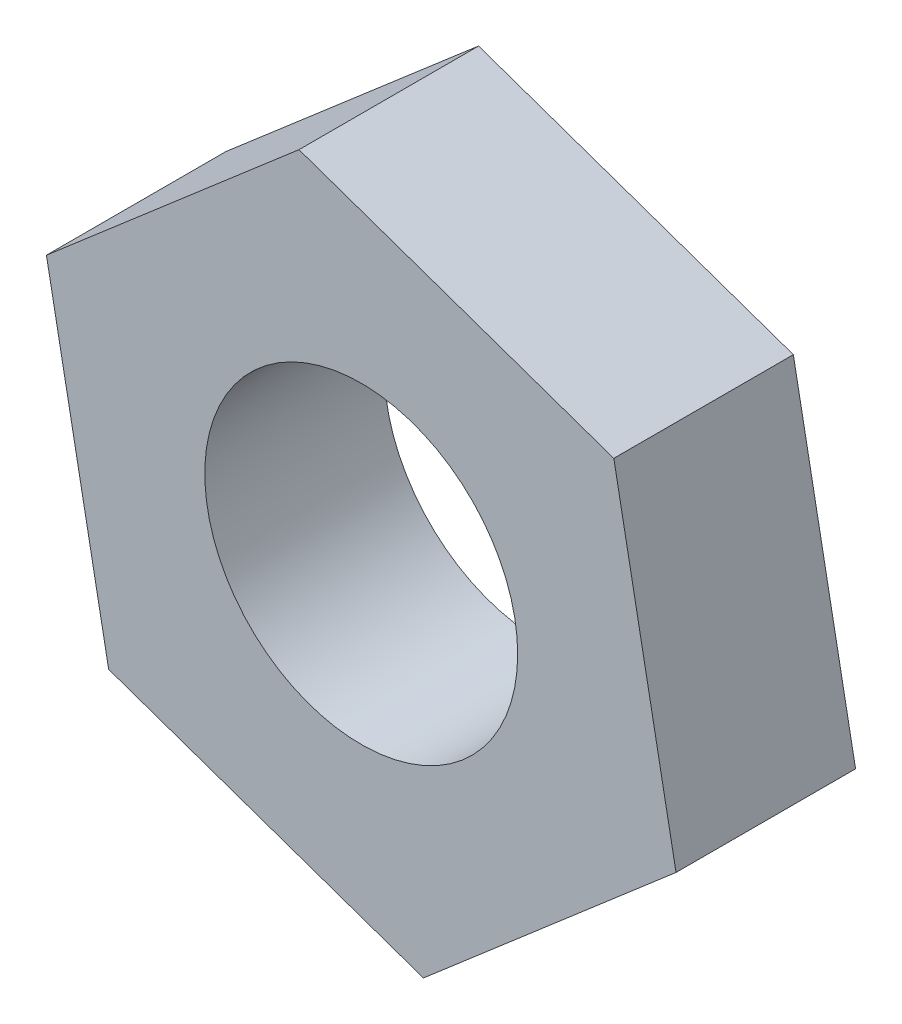
ISO-10303-21;
HEADER;
FILE_DESCRIPTION(('STEP AP214'),'2;1');
FILE_NAME('part.step','',(''),(''),'','','');
FILE_SCHEMA(('AUTOMOTIVE_DESIGN { 1 0 10303 214 1 1 1 1 }'));
ENDSEC;
DATA;
#1=APPLICATION_CONTEXT('core data for automotive mechanical design processes');
#2=APPLICATION_PROTOCOL_DEFINITION('international standard','automotive_design',2000,#1);
#3=PRODUCT_CONTEXT('',#1,'mechanical');
#4=PRODUCT('Part','Part','',(#3));
#5=PRODUCT_RELATED_PRODUCT_CATEGORY('part','',(#4));
#6=PRODUCT_DEFINITION_FORMATION('','',#4);
#7=PRODUCT_DEFINITION_CONTEXT('part definition',#1,'design');
#8=PRODUCT_DEFINITION('design','',#6,#7);
#9=PRODUCT_DEFINITION_SHAPE('','',#8);
#10=(LENGTH_UNIT() NAMED_UNIT(*) SI_UNIT(.MILLI.,.METRE.));
#11=(NAMED_UNIT(*) PLANE_ANGLE_UNIT() SI_UNIT($,.RADIAN.));
#12=(NAMED_UNIT(*) SI_UNIT($,.STERADIAN.) SOLID_ANGLE_UNIT());
#13=UNCERTAINTY_MEASURE_WITH_UNIT(LENGTH_MEASURE(1.E-05),#10,'distance_accuracy_value','');
#14=(GEOMETRIC_REPRESENTATION_CONTEXT(3) GLOBAL_UNCERTAINTY_ASSIGNED_CONTEXT((#13)) GLOBAL_UNIT_ASSIGNED_CONTEXT((#10,
#11,#12)) REPRESENTATION_CONTEXT('',''));
#15=CARTESIAN_POINT('',(0.,0.,0.));
#16=DIRECTION('',(0.,0.,1.));
#17=DIRECTION('',(1.,0.,0.));
#18=AXIS2_PLACEMENT_3D('',#15,#16,#17);
#19=CARTESIAN_POINT('',(2.42563283035795,-12.7716993924963,7.));
#20=DIRECTION('',(0.,0.,1.));
#21=DIRECTION('',(1.,0.,0.));
#22=AXIS2_PLACEMENT_3D('',#19,#20,#21);
#23=PLANE('',#22);
#24=DIRECTION('',(0.94411019527531,-0.329630003454201,0.));
#25=VECTOR('',#24,1.);
#26=CARTESIAN_POINT('',(-9.84779970822106,-8.48650934759167,7.));
#27=LINE('',#26,#25);
#28=CARTESIAN_POINT('',(-9.84779970822106,-8.48650934759167,7.));
#29=VERTEX_POINT('',#28);
#30=CARTESIAN_POINT('',(2.42563283035795,-12.7716993924963,7.));
#31=VERTEX_POINT('',#30);
#32=EDGE_CURVE('E128',#29,#31,#27,.T.);
#33=ORIENTED_EDGE('',*,*,#32,.T.);
#34=DIRECTION('',(0.757523054478544,0.652808411353206,0.));
#35=VECTOR('',#34,1.);
#36=CARTESIAN_POINT('',(2.42563283035795,-12.7716993924963,7.));
#37=LINE('',#36,#35);
#38=CARTESIAN_POINT('',(12.273432538579,-4.28519004490459,7.));
#39=VERTEX_POINT('',#38);
#40=EDGE_CURVE('E86',#31,#39,#37,.T.);
#41=ORIENTED_EDGE('',*,*,#40,.T.);
#42=DIRECTION('',(-0.186587140796766,0.982438414807405,0.));
#43=VECTOR('',#42,1.);
#44=CARTESIAN_POINT('',(12.273432538579,-4.28519004490459,7.));
#45=LINE('',#44,#43);
#46=CARTESIAN_POINT('',(9.84779970822107,8.48650934759167,7.));
#47=VERTEX_POINT('',#46);
#48=EDGE_CURVE('E99',#39,#47,#45,.T.);
#49=ORIENTED_EDGE('',*,*,#48,.T.);
#50=DIRECTION('',(-0.94411019527531,0.3296300034542,0.));
#51=VECTOR('',#50,1.);
#52=CARTESIAN_POINT('',(9.84779970822107,8.48650934759167,7.));
#53=LINE('',#52,#51);
#54=CARTESIAN_POINT('',(-2.42563283035793,12.7716993924963,7.));
#55=VERTEX_POINT('',#54);
#56=EDGE_CURVE('E93',#47,#55,#53,.T.);
#57=ORIENTED_EDGE('',*,*,#56,.T.);
#58=DIRECTION('',(-0.757523054478545,-0.652808411353205,0.));
#59=VECTOR('',#58,1.);
#60=CARTESIAN_POINT('',(-2.42563283035793,12.7716993924963,7.));
#61=LINE('',#60,#59);
#62=CARTESIAN_POINT('',(-12.273432538579,4.28519004490459,7.));
#63=VERTEX_POINT('',#62);
#64=EDGE_CURVE('E97',#55,#63,#61,.T.);
#65=ORIENTED_EDGE('',*,*,#64,.T.);
#66=DIRECTION('',(0.186587140796765,-0.982438414807406,0.));
#67=VECTOR('',#66,1.);
#68=CARTESIAN_POINT('',(-12.273432538579,4.28519004490459,7.));
#69=LINE('',#68,#67);
#70=EDGE_CURVE('E49',#63,#29,#69,.T.);
#71=ORIENTED_EDGE('',*,*,#70,.T.);
#72=EDGE_LOOP('',(#33,#41,#49,#57,#65,#71));
#73=FACE_BOUND('',#72,.T.);
#74=CARTESIAN_POINT('',(0.,0.,7.));
#75=DIRECTION('',(0.,0.,1.));
#76=DIRECTION('',(1.,0.,0.));
#77=AXIS2_PLACEMENT_3D('',#74,#75,#76);
#78=CIRCLE('',#77,6.1);
#79=CARTESIAN_POINT('',(6.1,0.,7.));
#80=VERTEX_POINT('',#79);
#81=EDGE_CURVE('E121',#80,#80,#78,.T.);
#82=ORIENTED_EDGE('',*,*,#81,.F.);
#83=EDGE_LOOP('',(#82));
#84=FACE_BOUND('',#83,.T.);
#85=ADVANCED_FACE('F32',(#73,#84),#23,.T.);
#86=CARTESIAN_POINT('',(2.42563283035795,-12.7716993924963,0.));
#87=DIRECTION('',(0.,0.,1.));
#88=DIRECTION('',(1.,0.,0.));
#89=AXIS2_PLACEMENT_3D('',#86,#87,#88);
#90=PLANE('',#89);
#91=DIRECTION('',(0.94411019527531,-0.329630003454201,0.));
#92=VECTOR('',#91,1.);
#93=CARTESIAN_POINT('',(-9.84779970822106,-8.48650934759167,0.));
#94=LINE('',#93,#92);
#95=CARTESIAN_POINT('',(-9.84779970822106,-8.48650934759167,0.));
#96=VERTEX_POINT('',#95);
#97=CARTESIAN_POINT('',(2.42563283035795,-12.7716993924963,0.));
#98=VERTEX_POINT('',#97);
#99=EDGE_CURVE('E117',#96,#98,#94,.T.);
#100=ORIENTED_EDGE('',*,*,#99,.F.);
#101=DIRECTION('',(0.186587140796765,-0.982438414807406,0.));
#102=VECTOR('',#101,1.);
#103=CARTESIAN_POINT('',(-12.273432538579,4.28519004490459,0.));
#104=LINE('',#103,#102);
#105=CARTESIAN_POINT('',(-12.273432538579,4.28519004490459,0.));
#106=VERTEX_POINT('',#105);
#107=EDGE_CURVE('E78',#106,#96,#104,.T.);
#108=ORIENTED_EDGE('',*,*,#107,.F.);
#109=DIRECTION('',(-0.757523054478545,-0.652808411353205,0.));
#110=VECTOR('',#109,1.);
#111=CARTESIAN_POINT('',(-2.42563283035793,12.7716993924963,0.));
#112=LINE('',#111,#110);
#113=CARTESIAN_POINT('',(-2.42563283035793,12.7716993924963,0.));
#114=VERTEX_POINT('',#113);
#115=EDGE_CURVE('E72',#114,#106,#112,.T.);
#116=ORIENTED_EDGE('',*,*,#115,.F.);
#117=DIRECTION('',(-0.94411019527531,0.3296300034542,0.));
#118=VECTOR('',#117,1.);
#119=CARTESIAN_POINT('',(9.84779970822107,8.48650934759167,0.));
#120=LINE('',#119,#118);
#121=CARTESIAN_POINT('',(9.84779970822107,8.48650934759167,0.));
#122=VERTEX_POINT('',#121);
#123=EDGE_CURVE('E107',#122,#114,#120,.T.);
#124=ORIENTED_EDGE('',*,*,#123,.F.);
#125=DIRECTION('',(-0.186587140796766,0.982438414807405,0.));
#126=VECTOR('',#125,1.);
#127=CARTESIAN_POINT('',(12.273432538579,-4.28519004490459,0.));
#128=LINE('',#127,#126);
#129=CARTESIAN_POINT('',(12.273432538579,-4.28519004490459,0.));
#130=VERTEX_POINT('',#129);
#131=EDGE_CURVE('E123',#130,#122,#128,.T.);
#132=ORIENTED_EDGE('',*,*,#131,.F.);
#133=DIRECTION('',(0.757523054478544,0.652808411353206,0.));
#134=VECTOR('',#133,1.);
#135=CARTESIAN_POINT('',(2.42563283035795,-12.7716993924963,0.));
#136=LINE('',#135,#134);
#137=EDGE_CURVE('E120',#98,#130,#136,.T.);
#138=ORIENTED_EDGE('',*,*,#137,.F.);
#139=EDGE_LOOP('',(#100,#108,#116,#124,#132,#138));
#140=FACE_BOUND('',#139,.T.);
#141=CARTESIAN_POINT('',(0.,0.,0.));
#142=DIRECTION('',(0.,0.,1.));
#143=DIRECTION('',(1.,0.,0.));
#144=AXIS2_PLACEMENT_3D('',#141,#142,#143);
#145=CIRCLE('',#144,6.1);
#146=CARTESIAN_POINT('',(6.1,0.,0.));
#147=VERTEX_POINT('',#146);
#148=EDGE_CURVE('E221',#147,#147,#145,.T.);
#149=ORIENTED_EDGE('',*,*,#148,.T.);
#150=EDGE_LOOP('',(#149));
#151=FACE_BOUND('',#150,.T.);
#152=ADVANCED_FACE('F137',(#140,#151),#90,.F.);
#153=CARTESIAN_POINT('',(-9.84779970822106,-8.48650934759167,7.));
#154=DIRECTION('',(0.329630003454201,0.94411019527531,0.));
#155=DIRECTION('',(-0.94411019527531,0.329630003454201,0.));
#156=AXIS2_PLACEMENT_3D('',#153,#154,#155);
#157=PLANE('',#156);
#158=ORIENTED_EDGE('',*,*,#99,.T.);
#159=DIRECTION('',(0.,0.,-1.));
#160=VECTOR('',#159,1.);
#161=CARTESIAN_POINT('',(2.42563283035795,-12.7716993924963,7.));
#162=LINE('',#161,#160);
#163=EDGE_CURVE('E11',#31,#98,#162,.T.);
#164=ORIENTED_EDGE('',*,*,#163,.F.);
#165=ORIENTED_EDGE('',*,*,#32,.F.);
#166=DIRECTION('',(0.,0.,-1.));
#167=VECTOR('',#166,1.);
#168=CARTESIAN_POINT('',(-9.84779970822106,-8.48650934759167,7.));
#169=LINE('',#168,#167);
#170=EDGE_CURVE('E113',#29,#96,#169,.T.);
#171=ORIENTED_EDGE('',*,*,#170,.T.);
#172=EDGE_LOOP('',(#158,#164,#165,#171));
#173=FACE_BOUND('',#172,.T.);
#174=ADVANCED_FACE('F34',(#173),#157,.F.);
#175=CARTESIAN_POINT('',(2.42563283035795,-12.7716993924963,7.));
#176=DIRECTION('',(-0.652808411353206,0.757523054478544,0.));
#177=DIRECTION('',(-0.757523054478544,-0.652808411353206,0.));
#178=AXIS2_PLACEMENT_3D('',#175,#176,#177);
#179=PLANE('',#178);
#180=ORIENTED_EDGE('',*,*,#137,.T.);
#181=DIRECTION('',(0.,0.,-1.));
#182=VECTOR('',#181,1.);
#183=CARTESIAN_POINT('',(12.273432538579,-4.28519004490459,7.));
#184=LINE('',#183,#182);
#185=EDGE_CURVE('E41',#39,#130,#184,.T.);
#186=ORIENTED_EDGE('',*,*,#185,.F.);
#187=ORIENTED_EDGE('',*,*,#40,.F.);
#188=ORIENTED_EDGE('',*,*,#163,.T.);
#189=EDGE_LOOP('',(#180,#186,#187,#188));
#190=FACE_BOUND('',#189,.T.);
#191=ADVANCED_FACE('F162',(#190),#179,.F.);
#192=CARTESIAN_POINT('',(12.273432538579,-4.28519004490459,7.));
#193=DIRECTION('',(-0.982438414807405,-0.186587140796766,0.));
#194=DIRECTION('',(0.186587140796766,-0.982438414807406,0.));
#195=AXIS2_PLACEMENT_3D('',#192,#193,#194);
#196=PLANE('',#195);
#197=ORIENTED_EDGE('',*,*,#131,.T.);
#198=DIRECTION('',(0.,0.,-1.));
#199=VECTOR('',#198,1.);
#200=CARTESIAN_POINT('',(9.84779970822107,8.48650934759167,7.));
#201=LINE('',#200,#199);
#202=EDGE_CURVE('E108',#47,#122,#201,.T.);
#203=ORIENTED_EDGE('',*,*,#202,.F.);
#204=ORIENTED_EDGE('',*,*,#48,.F.);
#205=ORIENTED_EDGE('',*,*,#185,.T.);
#206=EDGE_LOOP('',(#197,#203,#204,#205));
#207=FACE_BOUND('',#206,.T.);
#208=ADVANCED_FACE('F134',(#207),#196,.F.);
#209=CARTESIAN_POINT('',(9.84779970822107,8.48650934759167,7.));
#210=DIRECTION('',(-0.3296300034542,-0.94411019527531,0.));
#211=DIRECTION('',(0.94411019527531,-0.3296300034542,0.));
#212=AXIS2_PLACEMENT_3D('',#209,#210,#211);
#213=PLANE('',#212);
#214=ORIENTED_EDGE('',*,*,#123,.T.);
#215=DIRECTION('',(0.,0.,-1.));
#216=VECTOR('',#215,1.);
#217=CARTESIAN_POINT('',(-2.42563283035793,12.7716993924963,7.));
#218=LINE('',#217,#216);
#219=EDGE_CURVE('E104',#55,#114,#218,.T.);
#220=ORIENTED_EDGE('',*,*,#219,.F.);
#221=ORIENTED_EDGE('',*,*,#56,.F.);
#222=ORIENTED_EDGE('',*,*,#202,.T.);
#223=EDGE_LOOP('',(#214,#220,#221,#222));
#224=FACE_BOUND('',#223,.T.);
#225=ADVANCED_FACE('F105',(#224),#213,.F.);
#226=CARTESIAN_POINT('',(-2.42563283035793,12.7716993924963,7.));
#227=DIRECTION('',(0.652808411353205,-0.757523054478545,0.));
#228=DIRECTION('',(0.757523054478545,0.652808411353205,0.));
#229=AXIS2_PLACEMENT_3D('',#226,#227,#228);
#230=PLANE('',#229);
#231=ORIENTED_EDGE('',*,*,#115,.T.);
#232=DIRECTION('',(0.,0.,-1.));
#233=VECTOR('',#232,1.);
#234=CARTESIAN_POINT('',(-12.273432538579,4.28519004490459,7.));
#235=LINE('',#234,#233);
#236=EDGE_CURVE('E109',#63,#106,#235,.T.);
#237=ORIENTED_EDGE('',*,*,#236,.F.);
#238=ORIENTED_EDGE('',*,*,#64,.F.);
#239=ORIENTED_EDGE('',*,*,#219,.T.);
#240=EDGE_LOOP('',(#231,#237,#238,#239));
#241=FACE_BOUND('',#240,.T.);
#242=ADVANCED_FACE('F111',(#241),#230,.F.);
#243=CARTESIAN_POINT('',(-12.273432538579,4.28519004490459,7.));
#244=DIRECTION('',(0.982438414807406,0.186587140796765,0.));
#245=DIRECTION('',(-0.186587140796765,0.982438414807406,0.));
#246=AXIS2_PLACEMENT_3D('',#243,#244,#245);
#247=PLANE('',#246);
#248=ORIENTED_EDGE('',*,*,#107,.T.);
#249=ORIENTED_EDGE('',*,*,#170,.F.);
#250=ORIENTED_EDGE('',*,*,#70,.F.);
#251=ORIENTED_EDGE('',*,*,#236,.T.);
#252=EDGE_LOOP('',(#248,#249,#250,#251));
#253=FACE_BOUND('',#252,.T.);
#254=ADVANCED_FACE('F142',(#253),#247,.F.);
#255=CARTESIAN_POINT('',(0.,0.,7.));
#256=DIRECTION('',(0.,0.,-1.));
#257=DIRECTION('',(-1.,0.,0.));
#258=AXIS2_PLACEMENT_3D('',#255,#256,#257);
#259=CYLINDRICAL_SURFACE('',#258,6.1);
#260=ORIENTED_EDGE('',*,*,#81,.T.);
#261=EDGE_LOOP('',(#260));
#262=FACE_BOUND('',#261,.T.);
#263=ORIENTED_EDGE('',*,*,#148,.F.);
#264=EDGE_LOOP('',(#263));
#265=FACE_BOUND('',#264,.T.);
#266=ADVANCED_FACE('F144',(#262,#265),#259,.F.);
#267=CLOSED_SHELL('',(#85,#152,#174,#191,#208,#225,#242,#254,#266));
#268=MANIFOLD_SOLID_BREP('B2',#267);
#269=ADVANCED_BREP_SHAPE_REPRESENTATION('',(#18,#268),#14);
#270=SHAPE_DEFINITION_REPRESENTATION(#9,#269);
ENDSEC;
END-ISO-10303-21;
